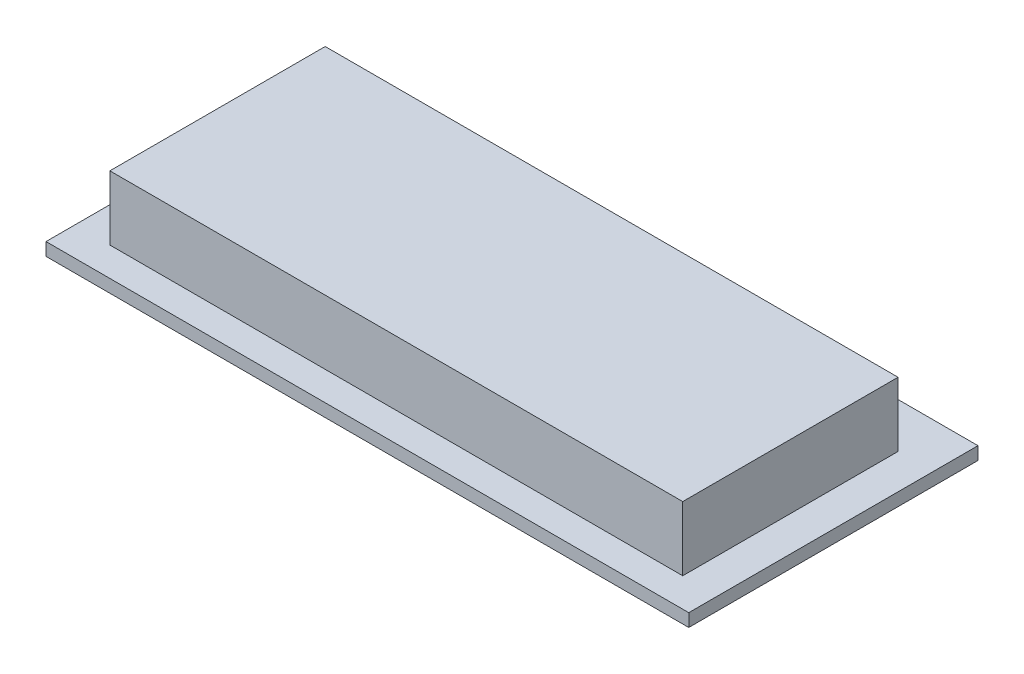
ISO-10303-21;
HEADER;
FILE_DESCRIPTION(('STEP AP214'),'2;1');
FILE_NAME('part.step','',(''),(''),'','','');
FILE_SCHEMA(('AUTOMOTIVE_DESIGN { 1 0 10303 214 1 1 1 1 }'));
ENDSEC;
DATA;
#1=APPLICATION_CONTEXT('core data for automotive mechanical design processes');
#2=APPLICATION_PROTOCOL_DEFINITION('international standard','automotive_design',2000,#1);
#3=PRODUCT_CONTEXT('',#1,'mechanical');
#4=PRODUCT('Part','Part','',(#3));
#5=PRODUCT_RELATED_PRODUCT_CATEGORY('part','',(#4));
#6=PRODUCT_DEFINITION_FORMATION('','',#4);
#7=PRODUCT_DEFINITION_CONTEXT('part definition',#1,'design');
#8=PRODUCT_DEFINITION('design','',#6,#7);
#9=PRODUCT_DEFINITION_SHAPE('','',#8);
#10=(LENGTH_UNIT() NAMED_UNIT(*) SI_UNIT(.MILLI.,.METRE.));
#11=(NAMED_UNIT(*) PLANE_ANGLE_UNIT() SI_UNIT($,.RADIAN.));
#12=(NAMED_UNIT(*) SI_UNIT($,.STERADIAN.) SOLID_ANGLE_UNIT());
#13=UNCERTAINTY_MEASURE_WITH_UNIT(LENGTH_MEASURE(1.E-05),#10,'distance_accuracy_value','');
#14=(GEOMETRIC_REPRESENTATION_CONTEXT(3) GLOBAL_UNCERTAINTY_ASSIGNED_CONTEXT((#13)) GLOBAL_UNIT_ASSIGNED_CONTEXT((#10,
#11,#12)) REPRESENTATION_CONTEXT('',''));
#15=CARTESIAN_POINT('',(0.,0.,0.));
#16=DIRECTION('',(0.,0.,1.));
#17=DIRECTION('',(1.,0.,0.));
#18=AXIS2_PLACEMENT_3D('',#15,#16,#17);
#19=CARTESIAN_POINT('',(-79.,1.6,-42.1385135135135));
#20=DIRECTION('',(1.,0.,0.));
#21=DIRECTION('',(0.,0.,-1.));
#22=AXIS2_PLACEMENT_3D('',#19,#20,#21);
#23=PLANE('',#22);
#24=DIRECTION('',(0.,0.,1.));
#25=VECTOR('',#24,1.);
#26=CARTESIAN_POINT('',(-79.,0.,-42.1385135135135));
#27=LINE('',#26,#25);
#28=CARTESIAN_POINT('',(-79.,0.,-42.1385135135135));
#29=VERTEX_POINT('',#28);
#30=CARTESIAN_POINT('',(-79.,0.,-6.13851351351352));
#31=VERTEX_POINT('',#30);
#32=EDGE_CURVE('E116',#29,#31,#27,.T.);
#33=ORIENTED_EDGE('',*,*,#32,.T.);
#34=DIRECTION('',(0.,-1.,0.));
#35=VECTOR('',#34,1.);
#36=CARTESIAN_POINT('',(-79.,1.6,-6.13851351351352));
#37=LINE('',#36,#35);
#38=CARTESIAN_POINT('',(-79.,1.6,-6.13851351351352));
#39=VERTEX_POINT('',#38);
#40=EDGE_CURVE('E11',#39,#31,#37,.T.);
#41=ORIENTED_EDGE('',*,*,#40,.F.);
#42=DIRECTION('',(0.,0.,1.));
#43=VECTOR('',#42,1.);
#44=CARTESIAN_POINT('',(-79.,1.6,-42.1385135135135));
#45=LINE('',#44,#43);
#46=CARTESIAN_POINT('',(-79.,1.6,-42.1385135135135));
#47=VERTEX_POINT('',#46);
#48=EDGE_CURVE('E125',#47,#39,#45,.T.);
#49=ORIENTED_EDGE('',*,*,#48,.F.);
#50=DIRECTION('',(0.,-1.,0.));
#51=VECTOR('',#50,1.);
#52=CARTESIAN_POINT('',(-79.,1.6,-42.1385135135135));
#53=LINE('',#52,#51);
#54=EDGE_CURVE('E134',#47,#29,#53,.T.);
#55=ORIENTED_EDGE('',*,*,#54,.T.);
#56=EDGE_LOOP('',(#33,#41,#49,#55));
#57=FACE_BOUND('',#56,.T.);
#58=ADVANCED_FACE('F32',(#57),#23,.F.);
#59=CARTESIAN_POINT('',(-79.,1.6,-6.13851351351352));
#60=DIRECTION('',(0.,0.,-1.));
#61=DIRECTION('',(-1.,0.,0.));
#62=AXIS2_PLACEMENT_3D('',#59,#60,#61);
#63=PLANE('',#62);
#64=DIRECTION('',(1.,0.,0.));
#65=VECTOR('',#64,1.);
#66=CARTESIAN_POINT('',(-79.,0.,-6.13851351351352));
#67=LINE('',#66,#65);
#68=CARTESIAN_POINT('',(1.,0.,-6.13851351351352));
#69=VERTEX_POINT('',#68);
#70=EDGE_CURVE('E119',#31,#69,#67,.T.);
#71=ORIENTED_EDGE('',*,*,#70,.T.);
#72=DIRECTION('',(0.,-1.,0.));
#73=VECTOR('',#72,1.);
#74=CARTESIAN_POINT('',(1.,1.6,-6.13851351351352));
#75=LINE('',#74,#73);
#76=CARTESIAN_POINT('',(1.,1.6,-6.13851351351352));
#77=VERTEX_POINT('',#76);
#78=EDGE_CURVE('E39',#77,#69,#75,.T.);
#79=ORIENTED_EDGE('',*,*,#78,.F.);
#80=DIRECTION('',(1.,0.,0.));
#81=VECTOR('',#80,1.);
#82=CARTESIAN_POINT('',(-79.,1.6,-6.13851351351352));
#83=LINE('',#82,#81);
#84=EDGE_CURVE('E128',#39,#77,#83,.T.);
#85=ORIENTED_EDGE('',*,*,#84,.F.);
#86=ORIENTED_EDGE('',*,*,#40,.T.);
#87=EDGE_LOOP('',(#71,#79,#85,#86));
#88=FACE_BOUND('',#87,.T.);
#89=ADVANCED_FACE('F165',(#88),#63,.F.);
#90=CARTESIAN_POINT('',(1.,1.6,-42.1385135135135));
#91=DIRECTION('',(-1.,0.,0.));
#92=DIRECTION('',(0.,0.,1.));
#93=AXIS2_PLACEMENT_3D('',#90,#91,#92);
#94=PLANE('',#93);
#95=DIRECTION('',(0.,0.,-1.));
#96=VECTOR('',#95,1.);
#97=CARTESIAN_POINT('',(1.,0.,-42.1385135135135));
#98=LINE('',#97,#96);
#99=CARTESIAN_POINT('',(1.,0.,-42.1385135135135));
#100=VERTEX_POINT('',#99);
#101=EDGE_CURVE('E137',#69,#100,#98,.T.);
#102=ORIENTED_EDGE('',*,*,#101,.T.);
#103=DIRECTION('',(0.,-1.,0.));
#104=VECTOR('',#103,1.);
#105=CARTESIAN_POINT('',(1.,1.6,-42.1385135135135));
#106=LINE('',#105,#104);
#107=CARTESIAN_POINT('',(1.,1.6,-42.1385135135135));
#108=VERTEX_POINT('',#107);
#109=EDGE_CURVE('E142',#108,#100,#106,.T.);
#110=ORIENTED_EDGE('',*,*,#109,.F.);
#111=DIRECTION('',(0.,0.,-1.));
#112=VECTOR('',#111,1.);
#113=CARTESIAN_POINT('',(1.,1.6,-42.1385135135135));
#114=LINE('',#113,#112);
#115=EDGE_CURVE('E131',#77,#108,#114,.T.);
#116=ORIENTED_EDGE('',*,*,#115,.F.);
#117=ORIENTED_EDGE('',*,*,#78,.T.);
#118=EDGE_LOOP('',(#102,#110,#116,#117));
#119=FACE_BOUND('',#118,.T.);
#120=ADVANCED_FACE('F149',(#119),#94,.F.);
#121=CARTESIAN_POINT('',(-79.,1.6,-42.1385135135135));
#122=DIRECTION('',(0.,0.,1.));
#123=DIRECTION('',(1.,0.,0.));
#124=AXIS2_PLACEMENT_3D('',#121,#122,#123);
#125=PLANE('',#124);
#126=DIRECTION('',(-1.,0.,0.));
#127=VECTOR('',#126,1.);
#128=CARTESIAN_POINT('',(-79.,0.,-42.1385135135135));
#129=LINE('',#128,#127);
#130=EDGE_CURVE('E129',#100,#29,#129,.T.);
#131=ORIENTED_EDGE('',*,*,#130,.T.);
#132=ORIENTED_EDGE('',*,*,#54,.F.);
#133=DIRECTION('',(-1.,0.,0.));
#134=VECTOR('',#133,1.);
#135=CARTESIAN_POINT('',(-79.,1.6,-42.1385135135135));
#136=LINE('',#135,#134);
#137=EDGE_CURVE('E133',#108,#47,#136,.T.);
#138=ORIENTED_EDGE('',*,*,#137,.F.);
#139=ORIENTED_EDGE('',*,*,#109,.T.);
#140=EDGE_LOOP('',(#131,#132,#138,#139));
#141=FACE_BOUND('',#140,.T.);
#142=ADVANCED_FACE('F158',(#141),#125,.F.);
#143=CARTESIAN_POINT('',(0.,1.6,0.));
#144=DIRECTION('',(0.,1.,0.));
#145=DIRECTION('',(0.,0.,1.));
#146=AXIS2_PLACEMENT_3D('',#143,#144,#145);
#147=PLANE('',#146);
#148=DIRECTION('',(0.,0.,1.));
#149=VECTOR('',#148,1.);
#150=CARTESIAN_POINT('',(-74.65,1.6,-36.5385135135135));
#151=LINE('',#150,#149);
#152=CARTESIAN_POINT('',(-74.65,1.6,-36.5385135135135));
#153=VERTEX_POINT('',#152);
#154=CARTESIAN_POINT('',(-74.65,1.6,-9.73851351351352));
#155=VERTEX_POINT('',#154);
#156=EDGE_CURVE('E46',#153,#155,#151,.T.);
#157=ORIENTED_EDGE('',*,*,#156,.F.);
#158=DIRECTION('',(-1.,0.,0.));
#159=VECTOR('',#158,1.);
#160=CARTESIAN_POINT('',(-74.65,1.6,-36.5385135135135));
#161=LINE('',#160,#159);
#162=CARTESIAN_POINT('',(-3.34999999999999,1.6,-36.5385135135135));
#163=VERTEX_POINT('',#162);
#164=EDGE_CURVE('E50',#163,#153,#161,.T.);
#165=ORIENTED_EDGE('',*,*,#164,.F.);
#166=DIRECTION('',(0.,0.,-1.));
#167=VECTOR('',#166,1.);
#168=CARTESIAN_POINT('',(-3.34999999999999,1.6,-36.5385135135135));
#169=LINE('',#168,#167);
#170=CARTESIAN_POINT('',(-3.34999999999999,1.6,-9.73851351351352));
#171=VERTEX_POINT('',#170);
#172=EDGE_CURVE('E259',#171,#163,#169,.T.);
#173=ORIENTED_EDGE('',*,*,#172,.F.);
#174=DIRECTION('',(1.,0.,0.));
#175=VECTOR('',#174,1.);
#176=CARTESIAN_POINT('',(-74.65,1.6,-9.73851351351352));
#177=LINE('',#176,#175);
#178=EDGE_CURVE('E265',#155,#171,#177,.T.);
#179=ORIENTED_EDGE('',*,*,#178,.F.);
#180=EDGE_LOOP('',(#157,#165,#173,#179));
#181=FACE_BOUND('',#180,.T.);
#182=ORIENTED_EDGE('',*,*,#48,.T.);
#183=ORIENTED_EDGE('',*,*,#84,.T.);
#184=ORIENTED_EDGE('',*,*,#115,.T.);
#185=ORIENTED_EDGE('',*,*,#137,.T.);
#186=EDGE_LOOP('',(#182,#183,#184,#185));
#187=FACE_BOUND('',#186,.T.);
#188=ADVANCED_FACE('F164',(#181,#187),#147,.T.);
#189=CARTESIAN_POINT('',(0.,0.,0.));
#190=DIRECTION('',(0.,1.,0.));
#191=DIRECTION('',(0.,0.,1.));
#192=AXIS2_PLACEMENT_3D('',#189,#190,#191);
#193=PLANE('',#192);
#194=ORIENTED_EDGE('',*,*,#32,.F.);
#195=ORIENTED_EDGE('',*,*,#130,.F.);
#196=ORIENTED_EDGE('',*,*,#101,.F.);
#197=ORIENTED_EDGE('',*,*,#70,.F.);
#198=EDGE_LOOP('',(#194,#195,#196,#197));
#199=FACE_BOUND('',#198,.T.);
#200=ADVANCED_FACE('F155',(#199),#193,.F.);
#201=CARTESIAN_POINT('',(-74.65,9.6,-36.5385135135135));
#202=DIRECTION('',(1.,0.,0.));
#203=DIRECTION('',(0.,0.,-1.));
#204=AXIS2_PLACEMENT_3D('',#201,#202,#203);
#205=PLANE('',#204);
#206=ORIENTED_EDGE('',*,*,#156,.T.);
#207=DIRECTION('',(0.,-1.,0.));
#208=VECTOR('',#207,1.);
#209=CARTESIAN_POINT('',(-74.65,9.6,-9.73851351351352));
#210=LINE('',#209,#208);
#211=CARTESIAN_POINT('',(-74.65,9.6,-9.73851351351352));
#212=VERTEX_POINT('',#211);
#213=EDGE_CURVE('E99',#212,#155,#210,.T.);
#214=ORIENTED_EDGE('',*,*,#213,.F.);
#215=DIRECTION('',(0.,0.,1.));
#216=VECTOR('',#215,1.);
#217=CARTESIAN_POINT('',(-74.65,9.6,-36.5385135135135));
#218=LINE('',#217,#216);
#219=CARTESIAN_POINT('',(-74.65,9.6,-36.5385135135135));
#220=VERTEX_POINT('',#219);
#221=EDGE_CURVE('E105',#220,#212,#218,.T.);
#222=ORIENTED_EDGE('',*,*,#221,.F.);
#223=DIRECTION('',(0.,-1.,0.));
#224=VECTOR('',#223,1.);
#225=CARTESIAN_POINT('',(-74.65,9.6,-36.5385135135135));
#226=LINE('',#225,#224);
#227=EDGE_CURVE('E257',#220,#153,#226,.T.);
#228=ORIENTED_EDGE('',*,*,#227,.T.);
#229=EDGE_LOOP('',(#206,#214,#222,#228));
#230=FACE_BOUND('',#229,.T.);
#231=ADVANCED_FACE('F115',(#230),#205,.F.);
#232=CARTESIAN_POINT('',(-74.65,9.6,-9.73851351351352));
#233=DIRECTION('',(0.,0.,-1.));
#234=DIRECTION('',(-1.,0.,0.));
#235=AXIS2_PLACEMENT_3D('',#232,#233,#234);
#236=PLANE('',#235);
#237=ORIENTED_EDGE('',*,*,#178,.T.);
#238=DIRECTION('',(0.,-1.,0.));
#239=VECTOR('',#238,1.);
#240=CARTESIAN_POINT('',(-3.34999999999999,9.6,-9.73851351351352));
#241=LINE('',#240,#239);
#242=CARTESIAN_POINT('',(-3.34999999999999,9.6,-9.73851351351352));
#243=VERTEX_POINT('',#242);
#244=EDGE_CURVE('E101',#243,#171,#241,.T.);
#245=ORIENTED_EDGE('',*,*,#244,.F.);
#246=DIRECTION('',(1.,0.,0.));
#247=VECTOR('',#246,1.);
#248=CARTESIAN_POINT('',(-74.65,9.6,-9.73851351351352));
#249=LINE('',#248,#247);
#250=EDGE_CURVE('E94',#212,#243,#249,.T.);
#251=ORIENTED_EDGE('',*,*,#250,.F.);
#252=ORIENTED_EDGE('',*,*,#213,.T.);
#253=EDGE_LOOP('',(#237,#245,#251,#252));
#254=FACE_BOUND('',#253,.T.);
#255=ADVANCED_FACE('F97',(#254),#236,.F.);
#256=CARTESIAN_POINT('',(-3.34999999999999,9.6,-36.5385135135135));
#257=DIRECTION('',(-1.,0.,0.));
#258=DIRECTION('',(0.,0.,1.));
#259=AXIS2_PLACEMENT_3D('',#256,#257,#258);
#260=PLANE('',#259);
#261=ORIENTED_EDGE('',*,*,#172,.T.);
#262=DIRECTION('',(0.,-1.,0.));
#263=VECTOR('',#262,1.);
#264=CARTESIAN_POINT('',(-3.34999999999999,9.6,-36.5385135135135));
#265=LINE('',#264,#263);
#266=CARTESIAN_POINT('',(-3.34999999999999,9.6,-36.5385135135135));
#267=VERTEX_POINT('',#266);
#268=EDGE_CURVE('E121',#267,#163,#265,.T.);
#269=ORIENTED_EDGE('',*,*,#268,.F.);
#270=DIRECTION('',(0.,0.,-1.));
#271=VECTOR('',#270,1.);
#272=CARTESIAN_POINT('',(-3.34999999999999,9.6,-36.5385135135135));
#273=LINE('',#272,#271);
#274=EDGE_CURVE('E104',#243,#267,#273,.T.);
#275=ORIENTED_EDGE('',*,*,#274,.F.);
#276=ORIENTED_EDGE('',*,*,#244,.T.);
#277=EDGE_LOOP('',(#261,#269,#275,#276));
#278=FACE_BOUND('',#277,.T.);
#279=ADVANCED_FACE('F183',(#278),#260,.F.);
#280=CARTESIAN_POINT('',(-74.65,9.6,-36.5385135135135));
#281=DIRECTION('',(0.,0.,1.));
#282=DIRECTION('',(1.,0.,0.));
#283=AXIS2_PLACEMENT_3D('',#280,#281,#282);
#284=PLANE('',#283);
#285=ORIENTED_EDGE('',*,*,#164,.T.);
#286=ORIENTED_EDGE('',*,*,#227,.F.);
#287=DIRECTION('',(-1.,0.,0.));
#288=VECTOR('',#287,1.);
#289=CARTESIAN_POINT('',(-74.65,9.6,-36.5385135135135));
#290=LINE('',#289,#288);
#291=EDGE_CURVE('E110',#267,#220,#290,.T.);
#292=ORIENTED_EDGE('',*,*,#291,.F.);
#293=ORIENTED_EDGE('',*,*,#268,.T.);
#294=EDGE_LOOP('',(#285,#286,#292,#293));
#295=FACE_BOUND('',#294,.T.);
#296=ADVANCED_FACE('F186',(#295),#284,.F.);
#297=CARTESIAN_POINT('',(0.,9.6,0.));
#298=DIRECTION('',(0.,1.,0.));
#299=DIRECTION('',(0.,0.,1.));
#300=AXIS2_PLACEMENT_3D('',#297,#298,#299);
#301=PLANE('',#300);
#302=ORIENTED_EDGE('',*,*,#221,.T.);
#303=ORIENTED_EDGE('',*,*,#250,.T.);
#304=ORIENTED_EDGE('',*,*,#274,.T.);
#305=ORIENTED_EDGE('',*,*,#291,.T.);
#306=EDGE_LOOP('',(#302,#303,#304,#305));
#307=FACE_BOUND('',#306,.T.);
#308=ADVANCED_FACE('F108',(#307),#301,.T.);
#309=CLOSED_SHELL('',(#58,#89,#120,#142,#188,#200,#231,#255,#279,#296,#308));
#310=MANIFOLD_SOLID_BREP('B2',#309);
#311=ADVANCED_BREP_SHAPE_REPRESENTATION('',(#18,#310),#14);
#312=SHAPE_DEFINITION_REPRESENTATION(#9,#311);
ENDSEC;
END-ISO-10303-21;
